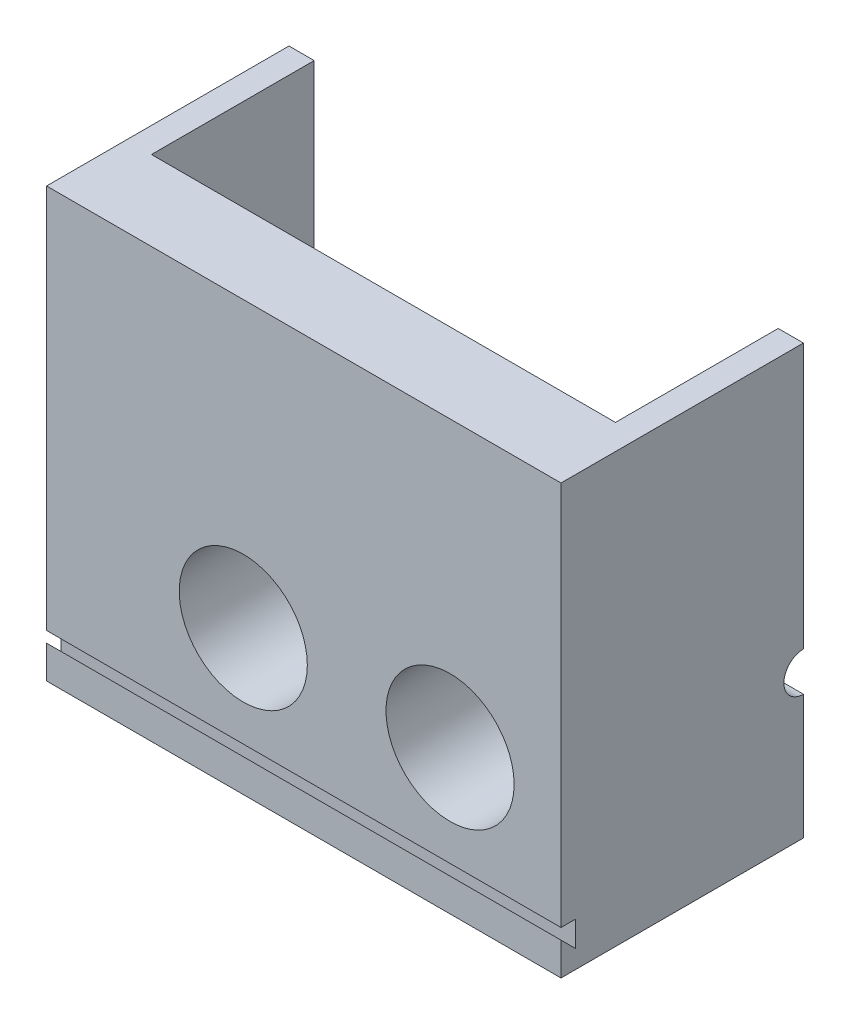
ISO-10303-21;
HEADER;
FILE_DESCRIPTION(('STEP AP214'),'2;1');
FILE_NAME('part.step','',(''),(''),'','','');
FILE_SCHEMA(('AUTOMOTIVE_DESIGN { 1 0 10303 214 1 1 1 1 }'));
ENDSEC;
DATA;
#1=APPLICATION_CONTEXT('core data for automotive mechanical design processes');
#2=APPLICATION_PROTOCOL_DEFINITION('international standard','automotive_design',2000,#1);
#3=PRODUCT_CONTEXT('',#1,'mechanical');
#4=PRODUCT('Part','Part','',(#3));
#5=PRODUCT_RELATED_PRODUCT_CATEGORY('part','',(#4));
#6=PRODUCT_DEFINITION_FORMATION('','',#4);
#7=PRODUCT_DEFINITION_CONTEXT('part definition',#1,'design');
#8=PRODUCT_DEFINITION('design','',#6,#7);
#9=PRODUCT_DEFINITION_SHAPE('','',#8);
#10=(LENGTH_UNIT() NAMED_UNIT(*) SI_UNIT(.MILLI.,.METRE.));
#11=(NAMED_UNIT(*) PLANE_ANGLE_UNIT() SI_UNIT($,.RADIAN.));
#12=(NAMED_UNIT(*) SI_UNIT($,.STERADIAN.) SOLID_ANGLE_UNIT());
#13=UNCERTAINTY_MEASURE_WITH_UNIT(LENGTH_MEASURE(1.E-05),#10,'distance_accuracy_value','');
#14=(GEOMETRIC_REPRESENTATION_CONTEXT(3) GLOBAL_UNCERTAINTY_ASSIGNED_CONTEXT((#13)) GLOBAL_UNIT_ASSIGNED_CONTEXT((#10,
#11,#12)) REPRESENTATION_CONTEXT('',''));
#15=CARTESIAN_POINT('',(0.,0.,0.));
#16=DIRECTION('',(0.,0.,1.));
#17=DIRECTION('',(1.,0.,0.));
#18=AXIS2_PLACEMENT_3D('',#15,#16,#17);
#19=CARTESIAN_POINT('',(51.,85.,48.065));
#20=DIRECTION('',(0.,0.,-1.));
#21=DIRECTION('',(-1.,0.,0.));
#22=AXIS2_PLACEMENT_3D('',#19,#20,#21);
#23=PLANE('',#22);
#24=CARTESIAN_POINT('',(29.,28.575,48.065));
#25=DIRECTION('',(0.,0.,1.));
#26=DIRECTION('',(1.,0.,0.));
#27=AXIS2_PLACEMENT_3D('',#24,#25,#26);
#28=CIRCLE('',#27,12.7);
#29=CARTESIAN_POINT('',(41.7,28.575,48.065));
#30=VERTEX_POINT('',#29);
#31=EDGE_CURVE('E416',#30,#30,#28,.T.);
#32=ORIENTED_EDGE('',*,*,#31,.F.);
#33=EDGE_LOOP('',(#32));
#34=FACE_BOUND('',#33,.T.);
#35=CARTESIAN_POINT('',(-12.,28.575,48.065));
#36=DIRECTION('',(0.,0.,1.));
#37=DIRECTION('',(1.,0.,0.));
#38=AXIS2_PLACEMENT_3D('',#35,#36,#37);
#39=CIRCLE('',#38,12.7);
#40=CARTESIAN_POINT('',(0.700000000000003,28.575,48.065));
#41=VERTEX_POINT('',#40);
#42=EDGE_CURVE('E417',#41,#41,#39,.T.);
#43=ORIENTED_EDGE('',*,*,#42,.F.);
#44=EDGE_LOOP('',(#43));
#45=FACE_BOUND('',#44,.T.);
#46=DIRECTION('',(0.,-1.,0.));
#47=VECTOR('',#46,1.);
#48=CARTESIAN_POINT('',(-51.,85.,48.065));
#49=LINE('',#48,#47);
#50=CARTESIAN_POINT('',(-51.,85.,48.065));
#51=VERTEX_POINT('',#50);
#52=CARTESIAN_POINT('',(-51.,8.67157287525382,48.065));
#53=VERTEX_POINT('',#52);
#54=EDGE_CURVE('E176',#51,#53,#49,.T.);
#55=ORIENTED_EDGE('',*,*,#54,.T.);
#56=DIRECTION('',(1.,0.,0.));
#57=VECTOR('',#56,1.);
#58=CARTESIAN_POINT('',(-51.,8.67157287525382,48.065));
#59=LINE('',#58,#57);
#60=CARTESIAN_POINT('',(51.,8.67157287525382,48.065));
#61=VERTEX_POINT('',#60);
#62=EDGE_CURVE('E345',#53,#61,#59,.T.);
#63=ORIENTED_EDGE('',*,*,#62,.T.);
#64=DIRECTION('',(0.,-1.,0.));
#65=VECTOR('',#64,1.);
#66=CARTESIAN_POINT('',(51.,85.,48.065));
#67=LINE('',#66,#65);
#68=CARTESIAN_POINT('',(51.,85.,48.065));
#69=VERTEX_POINT('',#68);
#70=EDGE_CURVE('E177',#69,#61,#67,.T.);
#71=ORIENTED_EDGE('',*,*,#70,.F.);
#72=DIRECTION('',(1.,0.,0.));
#73=VECTOR('',#72,1.);
#74=CARTESIAN_POINT('',(51.,85.,48.065));
#75=LINE('',#74,#73);
#76=EDGE_CURVE('E445',#51,#69,#75,.T.);
#77=ORIENTED_EDGE('',*,*,#76,.F.);
#78=EDGE_LOOP('',(#55,#63,#71,#77));
#79=FACE_BOUND('',#78,.T.);
#80=ADVANCED_FACE('F41',(#34,#45,#79),#23,.F.);
#81=CARTESIAN_POINT('',(-46.,85.,32.265));
#82=DIRECTION('',(0.,0.,-1.));
#83=DIRECTION('',(-1.,0.,0.));
#84=AXIS2_PLACEMENT_3D('',#81,#82,#83);
#85=PLANE('',#84);
#86=CARTESIAN_POINT('',(29.,28.575,32.265));
#87=DIRECTION('',(0.,0.,-1.));
#88=DIRECTION('',(-1.,0.,0.));
#89=AXIS2_PLACEMENT_3D('',#86,#87,#88);
#90=CIRCLE('',#89,15.5);
#91=CARTESIAN_POINT('',(13.5,28.575,32.265));
#92=VERTEX_POINT('',#91);
#93=EDGE_CURVE('E353',#92,#92,#90,.T.);
#94=ORIENTED_EDGE('',*,*,#93,.F.);
#95=EDGE_LOOP('',(#94));
#96=FACE_BOUND('',#95,.T.);
#97=DIRECTION('',(1.,0.,0.));
#98=VECTOR('',#97,1.);
#99=CARTESIAN_POINT('',(-46.,0.,32.265));
#100=LINE('',#99,#98);
#101=CARTESIAN_POINT('',(-46.,0.,32.265));
#102=VERTEX_POINT('',#101);
#103=CARTESIAN_POINT('',(46.,0.,32.265));
#104=VERTEX_POINT('',#103);
#105=EDGE_CURVE('E427',#102,#104,#100,.T.);
#106=ORIENTED_EDGE('',*,*,#105,.F.);
#107=DIRECTION('',(0.,-1.,0.));
#108=VECTOR('',#107,1.);
#109=CARTESIAN_POINT('',(-46.,85.,32.265));
#110=LINE('',#109,#108);
#111=CARTESIAN_POINT('',(-46.,85.,32.265));
#112=VERTEX_POINT('',#111);
#113=EDGE_CURVE('E440',#112,#102,#110,.T.);
#114=ORIENTED_EDGE('',*,*,#113,.F.);
#115=DIRECTION('',(1.,0.,0.));
#116=VECTOR('',#115,1.);
#117=CARTESIAN_POINT('',(-46.,85.,32.265));
#118=LINE('',#117,#116);
#119=CARTESIAN_POINT('',(46.,85.,32.265));
#120=VERTEX_POINT('',#119);
#121=EDGE_CURVE('E429',#112,#120,#118,.T.);
#122=ORIENTED_EDGE('',*,*,#121,.T.);
#123=DIRECTION('',(0.,-1.,0.));
#124=VECTOR('',#123,1.);
#125=CARTESIAN_POINT('',(46.,85.,32.265));
#126=LINE('',#125,#124);
#127=EDGE_CURVE('E431',#120,#104,#126,.T.);
#128=ORIENTED_EDGE('',*,*,#127,.T.);
#129=EDGE_LOOP('',(#106,#114,#122,#128));
#130=FACE_BOUND('',#129,.T.);
#131=CARTESIAN_POINT('',(-12.,28.575,32.265));
#132=DIRECTION('',(0.,0.,-1.));
#133=DIRECTION('',(-1.,0.,0.));
#134=AXIS2_PLACEMENT_3D('',#131,#132,#133);
#135=CIRCLE('',#134,15.5);
#136=CARTESIAN_POINT('',(-27.5,28.575,32.265));
#137=VERTEX_POINT('',#136);
#138=EDGE_CURVE('E350',#137,#137,#135,.T.);
#139=ORIENTED_EDGE('',*,*,#138,.F.);
#140=EDGE_LOOP('',(#139));
#141=FACE_BOUND('',#140,.T.);
#142=ADVANCED_FACE('F221',(#96,#130,#141),#85,.T.);
#143=CARTESIAN_POINT('',(0.,85.,0.));
#144=DIRECTION('',(0.,1.,0.));
#145=DIRECTION('',(0.,0.,1.));
#146=AXIS2_PLACEMENT_3D('',#143,#144,#145);
#147=PLANE('',#146);
#148=DIRECTION('',(-1.,0.,0.));
#149=VECTOR('',#148,1.);
#150=CARTESIAN_POINT('',(51.,85.,0.));
#151=LINE('',#150,#149);
#152=CARTESIAN_POINT('',(-46.,85.,0.));
#153=VERTEX_POINT('',#152);
#154=CARTESIAN_POINT('',(-51.,85.,0.));
#155=VERTEX_POINT('',#154);
#156=EDGE_CURVE('E396',#153,#155,#151,.T.);
#157=ORIENTED_EDGE('',*,*,#156,.T.);
#158=DIRECTION('',(0.,0.,1.));
#159=VECTOR('',#158,1.);
#160=CARTESIAN_POINT('',(-51.,85.,48.065));
#161=LINE('',#160,#159);
#162=EDGE_CURVE('E443',#155,#51,#161,.T.);
#163=ORIENTED_EDGE('',*,*,#162,.T.);
#164=ORIENTED_EDGE('',*,*,#76,.T.);
#165=DIRECTION('',(0.,0.,-1.));
#166=VECTOR('',#165,1.);
#167=CARTESIAN_POINT('',(51.,85.,48.065));
#168=LINE('',#167,#166);
#169=CARTESIAN_POINT('',(51.,85.,0.));
#170=VERTEX_POINT('',#169);
#171=EDGE_CURVE('E448',#69,#170,#168,.T.);
#172=ORIENTED_EDGE('',*,*,#171,.T.);
#173=CARTESIAN_POINT('',(46.,85.,0.));
#174=VERTEX_POINT('',#173);
#175=EDGE_CURVE('E392',#170,#174,#151,.T.);
#176=ORIENTED_EDGE('',*,*,#175,.T.);
#177=DIRECTION('',(0.,0.,-1.));
#178=VECTOR('',#177,1.);
#179=CARTESIAN_POINT('',(46.,85.,32.265));
#180=LINE('',#179,#178);
#181=EDGE_CURVE('E423',#120,#174,#180,.T.);
#182=ORIENTED_EDGE('',*,*,#181,.F.);
#183=ORIENTED_EDGE('',*,*,#121,.F.);
#184=DIRECTION('',(0.,0.,1.));
#185=VECTOR('',#184,1.);
#186=CARTESIAN_POINT('',(-46.,85.,32.265));
#187=LINE('',#186,#185);
#188=EDGE_CURVE('E426',#153,#112,#187,.T.);
#189=ORIENTED_EDGE('',*,*,#188,.F.);
#190=EDGE_LOOP('',(#157,#163,#164,#172,#176,#182,#183,#189));
#191=FACE_BOUND('',#190,.T.);
#192=ADVANCED_FACE('F228',(#191),#147,.T.);
#193=CARTESIAN_POINT('',(0.,0.,0.));
#194=DIRECTION('',(0.,1.,0.));
#195=DIRECTION('',(0.,0.,1.));
#196=AXIS2_PLACEMENT_3D('',#193,#194,#195);
#197=PLANE('',#196);
#198=DIRECTION('',(0.,0.,1.));
#199=VECTOR('',#198,1.);
#200=CARTESIAN_POINT('',(-51.,0.,48.065));
#201=LINE('',#200,#199);
#202=CARTESIAN_POINT('',(-51.,0.,0.));
#203=VERTEX_POINT('',#202);
#204=CARTESIAN_POINT('',(-51.,0.,48.065));
#205=VERTEX_POINT('',#204);
#206=EDGE_CURVE('E174',#203,#205,#201,.T.);
#207=ORIENTED_EDGE('',*,*,#206,.F.);
#208=DIRECTION('',(-1.,0.,0.));
#209=VECTOR('',#208,1.);
#210=CARTESIAN_POINT('',(51.,0.,0.));
#211=LINE('',#210,#209);
#212=CARTESIAN_POINT('',(-46.,0.,0.));
#213=VERTEX_POINT('',#212);
#214=EDGE_CURVE('E389',#213,#203,#211,.T.);
#215=ORIENTED_EDGE('',*,*,#214,.F.);
#216=DIRECTION('',(0.,0.,1.));
#217=VECTOR('',#216,1.);
#218=CARTESIAN_POINT('',(-46.,0.,32.265));
#219=LINE('',#218,#217);
#220=EDGE_CURVE('E434',#213,#102,#219,.T.);
#221=ORIENTED_EDGE('',*,*,#220,.T.);
#222=ORIENTED_EDGE('',*,*,#105,.T.);
#223=DIRECTION('',(0.,0.,-1.));
#224=VECTOR('',#223,1.);
#225=CARTESIAN_POINT('',(46.,0.,32.265));
#226=LINE('',#225,#224);
#227=CARTESIAN_POINT('',(46.,0.,0.));
#228=VERTEX_POINT('',#227);
#229=EDGE_CURVE('E420',#104,#228,#226,.T.);
#230=ORIENTED_EDGE('',*,*,#229,.T.);
#231=CARTESIAN_POINT('',(51.,0.,0.));
#232=VERTEX_POINT('',#231);
#233=EDGE_CURVE('E397',#232,#228,#211,.T.);
#234=ORIENTED_EDGE('',*,*,#233,.F.);
#235=DIRECTION('',(0.,0.,-1.));
#236=VECTOR('',#235,1.);
#237=CARTESIAN_POINT('',(51.,0.,48.065));
#238=LINE('',#237,#236);
#239=CARTESIAN_POINT('',(51.,0.,48.065));
#240=VERTEX_POINT('',#239);
#241=EDGE_CURVE('E446',#240,#232,#238,.T.);
#242=ORIENTED_EDGE('',*,*,#241,.F.);
#243=DIRECTION('',(1.,0.,0.));
#244=VECTOR('',#243,1.);
#245=CARTESIAN_POINT('',(51.,0.,48.065));
#246=LINE('',#245,#244);
#247=EDGE_CURVE('E452',#205,#240,#246,.T.);
#248=ORIENTED_EDGE('',*,*,#247,.F.);
#249=EDGE_LOOP('',(#207,#215,#221,#222,#230,#234,#242,#248));
#250=FACE_BOUND('',#249,.T.);
#251=ADVANCED_FACE('F242',(#250),#197,.F.);
#252=CARTESIAN_POINT('',(-51.,85.,48.065));
#253=DIRECTION('',(1.,0.,0.));
#254=DIRECTION('',(0.,0.,-1.));
#255=AXIS2_PLACEMENT_3D('',#252,#253,#254);
#256=PLANE('',#255);
#257=DIRECTION('',(0.,1.,0.));
#258=VECTOR('',#257,1.);
#259=CARTESIAN_POINT('',(-51.,3.67157287525381,45.2365728752538));
#260=LINE('',#259,#258);
#261=CARTESIAN_POINT('',(-51.,3.67157287525381,45.2365728752538));
#262=VERTEX_POINT('',#261);
#263=CARTESIAN_POINT('',(-51.,8.67157287525381,45.2365728752538));
#264=VERTEX_POINT('',#263);
#265=EDGE_CURVE('E160',#262,#264,#260,.T.);
#266=ORIENTED_EDGE('',*,*,#265,.T.);
#267=DIRECTION('',(0.,0.,1.));
#268=VECTOR('',#267,1.);
#269=CARTESIAN_POINT('',(-51.,8.67157287525381,45.2365728752538));
#270=LINE('',#269,#268);
#271=EDGE_CURVE('E170',#264,#53,#270,.T.);
#272=ORIENTED_EDGE('',*,*,#271,.T.);
#273=ORIENTED_EDGE('',*,*,#54,.F.);
#274=ORIENTED_EDGE('',*,*,#162,.F.);
#275=DIRECTION('',(0.,1.,0.));
#276=VECTOR('',#275,1.);
#277=CARTESIAN_POINT('',(-51.,85.,0.));
#278=LINE('',#277,#276);
#279=CARTESIAN_POINT('',(-51.,32.45,0.));
#280=VERTEX_POINT('',#279);
#281=EDGE_CURVE('E383',#280,#155,#278,.T.);
#282=ORIENTED_EDGE('',*,*,#281,.F.);
#283=CARTESIAN_POINT('',(-51.,28.575,0.));
#284=DIRECTION('',(-1.,0.,0.));
#285=DIRECTION('',(0.,0.,1.));
#286=AXIS2_PLACEMENT_3D('',#283,#284,#285);
#287=CIRCLE('',#286,3.875);
#288=CARTESIAN_POINT('',(-51.,24.7,0.));
#289=VERTEX_POINT('',#288);
#290=EDGE_CURVE('E411',#289,#280,#287,.T.);
#291=ORIENTED_EDGE('',*,*,#290,.F.);
#292=EDGE_CURVE('E64',#203,#289,#278,.T.);
#293=ORIENTED_EDGE('',*,*,#292,.F.);
#294=ORIENTED_EDGE('',*,*,#206,.T.);
#295=CARTESIAN_POINT('',(-51.,6.5,48.065));
#296=VERTEX_POINT('',#295);
#297=EDGE_CURVE('E167',#296,#205,#49,.T.);
#298=ORIENTED_EDGE('',*,*,#297,.F.);
#299=DIRECTION('',(0.,-0.707106781186547,-0.707106781186548));
#300=VECTOR('',#299,1.);
#301=CARTESIAN_POINT('',(-51.,6.5,48.065));
#302=LINE('',#301,#300);
#303=EDGE_CURVE('E153',#296,#262,#302,.T.);
#304=ORIENTED_EDGE('',*,*,#303,.T.);
#305=EDGE_LOOP('',(#266,#272,#273,#274,#282,#291,#293,#294,#298,#304));
#306=FACE_BOUND('',#305,.T.);
#307=ADVANCED_FACE('F172',(#306),#256,.F.);
#308=CARTESIAN_POINT('',(51.,6.50000000000001,48.065));
#309=VERTEX_POINT('',#308);
#310=EDGE_CURVE('E169',#309,#240,#67,.T.);
#311=ORIENTED_EDGE('',*,*,#310,.F.);
#312=DIRECTION('',(1.,0.,0.));
#313=VECTOR('',#312,1.);
#314=CARTESIAN_POINT('',(-51.,6.5,48.065));
#315=LINE('',#314,#313);
#316=EDGE_CURVE('E56',#296,#309,#315,.T.);
#317=ORIENTED_EDGE('',*,*,#316,.F.);
#318=ORIENTED_EDGE('',*,*,#297,.T.);
#319=ORIENTED_EDGE('',*,*,#247,.T.);
#320=EDGE_LOOP('',(#311,#317,#318,#319));
#321=FACE_BOUND('',#320,.T.);
#322=ADVANCED_FACE('F165',(#321),#23,.F.);
#323=CARTESIAN_POINT('',(51.,85.,48.065));
#324=DIRECTION('',(-1.,0.,0.));
#325=DIRECTION('',(0.,0.,1.));
#326=AXIS2_PLACEMENT_3D('',#323,#324,#325);
#327=PLANE('',#326);
#328=ORIENTED_EDGE('',*,*,#70,.T.);
#329=DIRECTION('',(0.,0.,1.));
#330=VECTOR('',#329,1.);
#331=CARTESIAN_POINT('',(51.,8.67157287525381,45.2365728752538));
#332=LINE('',#331,#330);
#333=CARTESIAN_POINT('',(51.,8.67157287525381,45.2365728752538));
#334=VERTEX_POINT('',#333);
#335=EDGE_CURVE('E161',#334,#61,#332,.T.);
#336=ORIENTED_EDGE('',*,*,#335,.F.);
#337=DIRECTION('',(0.,1.,0.));
#338=VECTOR('',#337,1.);
#339=CARTESIAN_POINT('',(51.,3.67157287525381,45.2365728752538));
#340=LINE('',#339,#338);
#341=CARTESIAN_POINT('',(51.,3.67157287525381,45.2365728752538));
#342=VERTEX_POINT('',#341);
#343=EDGE_CURVE('E333',#342,#334,#340,.T.);
#344=ORIENTED_EDGE('',*,*,#343,.F.);
#345=DIRECTION('',(0.,-0.707106781186547,-0.707106781186548));
#346=VECTOR('',#345,1.);
#347=CARTESIAN_POINT('',(51.,6.5,48.065));
#348=LINE('',#347,#346);
#349=EDGE_CURVE('E337',#309,#342,#348,.T.);
#350=ORIENTED_EDGE('',*,*,#349,.F.);
#351=ORIENTED_EDGE('',*,*,#310,.T.);
#352=ORIENTED_EDGE('',*,*,#241,.T.);
#353=DIRECTION('',(0.,1.,0.));
#354=VECTOR('',#353,1.);
#355=CARTESIAN_POINT('',(51.,85.,0.));
#356=LINE('',#355,#354);
#357=CARTESIAN_POINT('',(51.,24.7,0.));
#358=VERTEX_POINT('',#357);
#359=EDGE_CURVE('E386',#232,#358,#356,.T.);
#360=ORIENTED_EDGE('',*,*,#359,.T.);
#361=CARTESIAN_POINT('',(51.,28.575,0.));
#362=DIRECTION('',(-1.,0.,0.));
#363=DIRECTION('',(0.,0.,1.));
#364=AXIS2_PLACEMENT_3D('',#361,#362,#363);
#365=CIRCLE('',#364,3.875);
#366=CARTESIAN_POINT('',(51.,32.45,0.));
#367=VERTEX_POINT('',#366);
#368=EDGE_CURVE('E189',#358,#367,#365,.T.);
#369=ORIENTED_EDGE('',*,*,#368,.T.);
#370=EDGE_CURVE('E390',#367,#170,#356,.T.);
#371=ORIENTED_EDGE('',*,*,#370,.T.);
#372=ORIENTED_EDGE('',*,*,#171,.F.);
#373=EDGE_LOOP('',(#328,#336,#344,#350,#351,#352,#360,#369,#371,#372));
#374=FACE_BOUND('',#373,.T.);
#375=ADVANCED_FACE('F236',(#374),#327,.F.);
#376=CARTESIAN_POINT('',(46.,85.,32.265));
#377=DIRECTION('',(-1.,0.,0.));
#378=DIRECTION('',(0.,0.,1.));
#379=AXIS2_PLACEMENT_3D('',#376,#377,#378);
#380=PLANE('',#379);
#381=DIRECTION('',(0.,1.,0.));
#382=VECTOR('',#381,1.);
#383=CARTESIAN_POINT('',(46.,85.,0.));
#384=LINE('',#383,#382);
#385=CARTESIAN_POINT('',(46.,24.7,0.));
#386=VERTEX_POINT('',#385);
#387=EDGE_CURVE('E395',#228,#386,#384,.T.);
#388=ORIENTED_EDGE('',*,*,#387,.F.);
#389=ORIENTED_EDGE('',*,*,#229,.F.);
#390=ORIENTED_EDGE('',*,*,#127,.F.);
#391=ORIENTED_EDGE('',*,*,#181,.T.);
#392=CARTESIAN_POINT('',(46.,32.45,0.));
#393=VERTEX_POINT('',#392);
#394=EDGE_CURVE('E400',#393,#174,#384,.T.);
#395=ORIENTED_EDGE('',*,*,#394,.F.);
#396=CARTESIAN_POINT('',(46.,28.575,0.));
#397=DIRECTION('',(-1.,0.,0.));
#398=DIRECTION('',(0.,0.,1.));
#399=AXIS2_PLACEMENT_3D('',#396,#397,#398);
#400=CIRCLE('',#399,3.875);
#401=EDGE_CURVE('E188',#386,#393,#400,.T.);
#402=ORIENTED_EDGE('',*,*,#401,.F.);
#403=EDGE_LOOP('',(#388,#389,#390,#391,#395,#402));
#404=FACE_BOUND('',#403,.T.);
#405=ADVANCED_FACE('F240',(#404),#380,.T.);
#406=CARTESIAN_POINT('',(-46.,85.,32.265));
#407=DIRECTION('',(1.,0.,0.));
#408=DIRECTION('',(0.,0.,-1.));
#409=AXIS2_PLACEMENT_3D('',#406,#407,#408);
#410=PLANE('',#409);
#411=DIRECTION('',(0.,-1.,0.));
#412=VECTOR('',#411,1.);
#413=CARTESIAN_POINT('',(-46.,85.,0.));
#414=LINE('',#413,#412);
#415=CARTESIAN_POINT('',(-46.,32.45,0.));
#416=VERTEX_POINT('',#415);
#417=EDGE_CURVE('E406',#153,#416,#414,.T.);
#418=ORIENTED_EDGE('',*,*,#417,.F.);
#419=ORIENTED_EDGE('',*,*,#188,.T.);
#420=ORIENTED_EDGE('',*,*,#113,.T.);
#421=ORIENTED_EDGE('',*,*,#220,.F.);
#422=CARTESIAN_POINT('',(-46.,24.7,0.));
#423=VERTEX_POINT('',#422);
#424=EDGE_CURVE('E403',#423,#213,#414,.T.);
#425=ORIENTED_EDGE('',*,*,#424,.F.);
#426=CARTESIAN_POINT('',(-46.,28.575,0.));
#427=DIRECTION('',(1.,0.,0.));
#428=DIRECTION('',(0.,0.,-1.));
#429=AXIS2_PLACEMENT_3D('',#426,#427,#428);
#430=CIRCLE('',#429,3.875);
#431=EDGE_CURVE('E185',#416,#423,#430,.T.);
#432=ORIENTED_EDGE('',*,*,#431,.F.);
#433=EDGE_LOOP('',(#418,#419,#420,#421,#425,#432));
#434=FACE_BOUND('',#433,.T.);
#435=ADVANCED_FACE('F256',(#434),#410,.T.);
#436=CARTESIAN_POINT('',(29.,28.575,28.065));
#437=DIRECTION('',(0.,0.,1.));
#438=DIRECTION('',(1.,0.,0.));
#439=AXIS2_PLACEMENT_3D('',#436,#437,#438);
#440=CYLINDRICAL_SURFACE('',#439,12.7);
#441=CARTESIAN_POINT('',(29.,28.575,23.765));
#442=DIRECTION('',(0.,0.,-1.));
#443=DIRECTION('',(-1.,0.,0.));
#444=AXIS2_PLACEMENT_3D('',#441,#442,#443);
#445=CIRCLE('',#444,12.7);
#446=CARTESIAN_POINT('',(16.3,28.575,23.765));
#447=VERTEX_POINT('',#446);
#448=EDGE_CURVE('E49',#447,#447,#445,.T.);
#449=ORIENTED_EDGE('',*,*,#448,.T.);
#450=EDGE_LOOP('',(#449));
#451=FACE_BOUND('',#450,.T.);
#452=ORIENTED_EDGE('',*,*,#31,.T.);
#453=EDGE_LOOP('',(#452));
#454=FACE_BOUND('',#453,.T.);
#455=ADVANCED_FACE('F203',(#451,#454),#440,.F.);
#456=CARTESIAN_POINT('',(-12.,28.575,28.065));
#457=DIRECTION('',(0.,0.,1.));
#458=DIRECTION('',(1.,0.,0.));
#459=AXIS2_PLACEMENT_3D('',#456,#457,#458);
#460=CYLINDRICAL_SURFACE('',#459,12.7);
#461=CARTESIAN_POINT('',(-12.,28.575,23.765));
#462=DIRECTION('',(0.,0.,-1.));
#463=DIRECTION('',(-1.,0.,0.));
#464=AXIS2_PLACEMENT_3D('',#461,#462,#463);
#465=CIRCLE('',#464,12.7);
#466=CARTESIAN_POINT('',(-24.7,28.575,23.765));
#467=VERTEX_POINT('',#466);
#468=EDGE_CURVE('E195',#467,#467,#465,.T.);
#469=ORIENTED_EDGE('',*,*,#468,.T.);
#470=EDGE_LOOP('',(#469));
#471=FACE_BOUND('',#470,.T.);
#472=ORIENTED_EDGE('',*,*,#42,.T.);
#473=EDGE_LOOP('',(#472));
#474=FACE_BOUND('',#473,.T.);
#475=ADVANCED_FACE('F263',(#471,#474),#460,.F.);
#476=CARTESIAN_POINT('',(51.,28.575,0.));
#477=DIRECTION('',(-1.,0.,0.));
#478=DIRECTION('',(0.,0.,1.));
#479=AXIS2_PLACEMENT_3D('',#476,#477,#478);
#480=CYLINDRICAL_SURFACE('',#479,3.875);
#481=ORIENTED_EDGE('',*,*,#290,.T.);
#482=DIRECTION('',(-1.,0.,0.));
#483=VECTOR('',#482,1.);
#484=CARTESIAN_POINT('',(51.,32.45,0.));
#485=LINE('',#484,#483);
#486=EDGE_CURVE('E405',#280,#416,#485,.F.);
#487=ORIENTED_EDGE('',*,*,#486,.T.);
#488=ORIENTED_EDGE('',*,*,#431,.T.);
#489=DIRECTION('',(-1.,0.,0.));
#490=VECTOR('',#489,1.);
#491=CARTESIAN_POINT('',(51.,24.7,0.));
#492=LINE('',#491,#490);
#493=EDGE_CURVE('E401',#423,#289,#492,.T.);
#494=ORIENTED_EDGE('',*,*,#493,.T.);
#495=EDGE_LOOP('',(#481,#487,#488,#494));
#496=FACE_BOUND('',#495,.T.);
#497=ADVANCED_FACE('F266',(#496),#480,.F.);
#498=ORIENTED_EDGE('',*,*,#401,.T.);
#499=DIRECTION('',(-1.,0.,0.));
#500=VECTOR('',#499,1.);
#501=CARTESIAN_POINT('',(51.,32.45,0.));
#502=LINE('',#501,#500);
#503=EDGE_CURVE('E192',#393,#367,#502,.F.);
#504=ORIENTED_EDGE('',*,*,#503,.T.);
#505=ORIENTED_EDGE('',*,*,#368,.F.);
#506=DIRECTION('',(-1.,0.,0.));
#507=VECTOR('',#506,1.);
#508=CARTESIAN_POINT('',(51.,24.7,0.));
#509=LINE('',#508,#507);
#510=EDGE_CURVE('E180',#358,#386,#509,.T.);
#511=ORIENTED_EDGE('',*,*,#510,.T.);
#512=EDGE_LOOP('',(#498,#504,#505,#511));
#513=FACE_BOUND('',#512,.T.);
#514=ADVANCED_FACE('F270',(#513),#480,.F.);
#515=CARTESIAN_POINT('',(51.,85.,0.));
#516=DIRECTION('',(0.,0.,1.));
#517=DIRECTION('',(1.,0.,0.));
#518=AXIS2_PLACEMENT_3D('',#515,#516,#517);
#519=PLANE('',#518);
#520=CARTESIAN_POINT('',(48.5,4.675,0.));
#521=DIRECTION('',(0.,0.,-1.));
#522=DIRECTION('',(0.,-1.,0.));
#523=AXIS2_PLACEMENT_3D('',#520,#521,#522);
#524=CIRCLE('',#523,1.6);
#525=CARTESIAN_POINT('',(48.5,3.075,0.));
#526=VERTEX_POINT('',#525);
#527=EDGE_CURVE('E362',#526,#526,#524,.T.);
#528=ORIENTED_EDGE('',*,*,#527,.F.);
#529=EDGE_LOOP('',(#528));
#530=FACE_BOUND('',#529,.T.);
#531=ORIENTED_EDGE('',*,*,#387,.T.);
#532=ORIENTED_EDGE('',*,*,#510,.F.);
#533=ORIENTED_EDGE('',*,*,#359,.F.);
#534=ORIENTED_EDGE('',*,*,#233,.T.);
#535=EDGE_LOOP('',(#531,#532,#533,#534));
#536=FACE_BOUND('',#535,.T.);
#537=ADVANCED_FACE('F272',(#530,#536),#519,.F.);
#538=CARTESIAN_POINT('',(48.5,58.725,0.));
#539=DIRECTION('',(0.,0.,-1.));
#540=DIRECTION('',(0.,1.,0.));
#541=AXIS2_PLACEMENT_3D('',#538,#539,#540);
#542=CIRCLE('',#541,1.6);
#543=CARTESIAN_POINT('',(48.5,60.325,0.));
#544=VERTEX_POINT('',#543);
#545=EDGE_CURVE('E365',#544,#544,#542,.T.);
#546=ORIENTED_EDGE('',*,*,#545,.F.);
#547=EDGE_LOOP('',(#546));
#548=FACE_BOUND('',#547,.T.);
#549=ORIENTED_EDGE('',*,*,#394,.T.);
#550=ORIENTED_EDGE('',*,*,#175,.F.);
#551=ORIENTED_EDGE('',*,*,#370,.F.);
#552=ORIENTED_EDGE('',*,*,#503,.F.);
#553=EDGE_LOOP('',(#549,#550,#551,#552));
#554=FACE_BOUND('',#553,.T.);
#555=ADVANCED_FACE('F275',(#548,#554),#519,.F.);
#556=CARTESIAN_POINT('',(-48.5,4.675,0.));
#557=DIRECTION('',(0.,0.,-1.));
#558=DIRECTION('',(0.,1.,0.));
#559=AXIS2_PLACEMENT_3D('',#556,#557,#558);
#560=CIRCLE('',#559,1.6);
#561=CARTESIAN_POINT('',(-48.5,6.275,0.));
#562=VERTEX_POINT('',#561);
#563=EDGE_CURVE('E369',#562,#562,#560,.T.);
#564=ORIENTED_EDGE('',*,*,#563,.F.);
#565=EDGE_LOOP('',(#564));
#566=FACE_BOUND('',#565,.T.);
#567=ORIENTED_EDGE('',*,*,#424,.T.);
#568=ORIENTED_EDGE('',*,*,#214,.T.);
#569=ORIENTED_EDGE('',*,*,#292,.T.);
#570=ORIENTED_EDGE('',*,*,#493,.F.);
#571=EDGE_LOOP('',(#567,#568,#569,#570));
#572=FACE_BOUND('',#571,.T.);
#573=ADVANCED_FACE('F479',(#566,#572),#519,.F.);
#574=CARTESIAN_POINT('',(-48.5,58.725,0.));
#575=DIRECTION('',(0.,0.,-1.));
#576=DIRECTION('',(0.,-1.,0.));
#577=AXIS2_PLACEMENT_3D('',#574,#575,#576);
#578=CIRCLE('',#577,1.6);
#579=CARTESIAN_POINT('',(-48.5,57.125,0.));
#580=VERTEX_POINT('',#579);
#581=EDGE_CURVE('E375',#580,#580,#578,.T.);
#582=ORIENTED_EDGE('',*,*,#581,.F.);
#583=EDGE_LOOP('',(#582));
#584=FACE_BOUND('',#583,.T.);
#585=ORIENTED_EDGE('',*,*,#417,.T.);
#586=ORIENTED_EDGE('',*,*,#486,.F.);
#587=ORIENTED_EDGE('',*,*,#281,.T.);
#588=ORIENTED_EDGE('',*,*,#156,.F.);
#589=EDGE_LOOP('',(#585,#586,#587,#588));
#590=FACE_BOUND('',#589,.T.);
#591=ADVANCED_FACE('F277',(#584,#590),#519,.F.);
#592=CARTESIAN_POINT('',(-48.5,58.725,10.));
#593=DIRECTION('',(0.,0.,-1.));
#594=DIRECTION('',(0.,1.,0.));
#595=AXIS2_PLACEMENT_3D('',#592,#593,#594);
#596=CYLINDRICAL_SURFACE('',#595,1.6);
#597=CARTESIAN_POINT('',(-48.5,58.725,10.));
#598=DIRECTION('',(0.,0.,-1.));
#599=DIRECTION('',(0.,-1.,0.));
#600=AXIS2_PLACEMENT_3D('',#597,#598,#599);
#601=CIRCLE('',#600,1.6);
#602=CARTESIAN_POINT('',(-48.5,57.125,10.));
#603=VERTEX_POINT('',#602);
#604=EDGE_CURVE('E359',#603,#603,#601,.T.);
#605=ORIENTED_EDGE('',*,*,#604,.F.);
#606=EDGE_LOOP('',(#605));
#607=FACE_BOUND('',#606,.T.);
#608=ORIENTED_EDGE('',*,*,#581,.T.);
#609=EDGE_LOOP('',(#608));
#610=FACE_BOUND('',#609,.T.);
#611=ADVANCED_FACE('F292',(#607,#610),#596,.F.);
#612=CARTESIAN_POINT('',(-48.5,58.725,10.));
#613=DIRECTION('',(0.,0.,1.));
#614=DIRECTION('',(0.,-1.,0.));
#615=AXIS2_PLACEMENT_3D('',#612,#613,#614);
#616=PLANE('',#615);
#617=ORIENTED_EDGE('',*,*,#604,.T.);
#618=EDGE_LOOP('',(#617));
#619=FACE_BOUND('',#618,.T.);
#620=ADVANCED_FACE('F288',(#619),#616,.F.);
#621=CARTESIAN_POINT('',(-48.5,4.675,10.));
#622=DIRECTION('',(0.,0.,-1.));
#623=DIRECTION('',(0.,1.,0.));
#624=AXIS2_PLACEMENT_3D('',#621,#622,#623);
#625=CYLINDRICAL_SURFACE('',#624,1.6);
#626=CARTESIAN_POINT('',(-48.5,4.675,10.));
#627=DIRECTION('',(0.,0.,-1.));
#628=DIRECTION('',(0.,1.,0.));
#629=AXIS2_PLACEMENT_3D('',#626,#627,#628);
#630=CIRCLE('',#629,1.6);
#631=CARTESIAN_POINT('',(-48.5,6.27499999999999,10.));
#632=VERTEX_POINT('',#631);
#633=EDGE_CURVE('E372',#632,#632,#630,.T.);
#634=ORIENTED_EDGE('',*,*,#633,.F.);
#635=EDGE_LOOP('',(#634));
#636=FACE_BOUND('',#635,.T.);
#637=ORIENTED_EDGE('',*,*,#563,.T.);
#638=EDGE_LOOP('',(#637));
#639=FACE_BOUND('',#638,.T.);
#640=ADVANCED_FACE('F291',(#636,#639),#625,.F.);
#641=CARTESIAN_POINT('',(-48.5,4.675,10.));
#642=DIRECTION('',(0.,0.,-1.));
#643=DIRECTION('',(0.,1.,0.));
#644=AXIS2_PLACEMENT_3D('',#641,#642,#643);
#645=PLANE('',#644);
#646=ORIENTED_EDGE('',*,*,#633,.T.);
#647=EDGE_LOOP('',(#646));
#648=FACE_BOUND('',#647,.T.);
#649=ADVANCED_FACE('F282',(#648),#645,.T.);
#650=CARTESIAN_POINT('',(48.5,58.725,10.));
#651=DIRECTION('',(0.,0.,-1.));
#652=DIRECTION('',(0.,1.,0.));
#653=AXIS2_PLACEMENT_3D('',#650,#651,#652);
#654=CYLINDRICAL_SURFACE('',#653,1.6);
#655=CARTESIAN_POINT('',(48.5,58.725,10.));
#656=DIRECTION('',(0.,0.,-1.));
#657=DIRECTION('',(0.,1.,0.));
#658=AXIS2_PLACEMENT_3D('',#655,#656,#657);
#659=CIRCLE('',#658,1.6);
#660=CARTESIAN_POINT('',(48.5,60.325,10.));
#661=VERTEX_POINT('',#660);
#662=EDGE_CURVE('E380',#661,#661,#659,.T.);
#663=ORIENTED_EDGE('',*,*,#662,.F.);
#664=EDGE_LOOP('',(#663));
#665=FACE_BOUND('',#664,.T.);
#666=ORIENTED_EDGE('',*,*,#545,.T.);
#667=EDGE_LOOP('',(#666));
#668=FACE_BOUND('',#667,.T.);
#669=ADVANCED_FACE('F278',(#665,#668),#654,.F.);
#670=CARTESIAN_POINT('',(48.5,58.725,10.));
#671=DIRECTION('',(0.,0.,-1.));
#672=DIRECTION('',(0.,1.,0.));
#673=AXIS2_PLACEMENT_3D('',#670,#671,#672);
#674=PLANE('',#673);
#675=ORIENTED_EDGE('',*,*,#662,.T.);
#676=EDGE_LOOP('',(#675));
#677=FACE_BOUND('',#676,.T.);
#678=ADVANCED_FACE('F281',(#677),#674,.T.);
#679=CARTESIAN_POINT('',(48.5,4.675,10.));
#680=DIRECTION('',(0.,0.,-1.));
#681=DIRECTION('',(0.,1.,0.));
#682=AXIS2_PLACEMENT_3D('',#679,#680,#681);
#683=CYLINDRICAL_SURFACE('',#682,1.6);
#684=CARTESIAN_POINT('',(48.5,4.675,10.));
#685=DIRECTION('',(0.,0.,-1.));
#686=DIRECTION('',(0.,-1.,0.));
#687=AXIS2_PLACEMENT_3D('',#684,#685,#686);
#688=CIRCLE('',#687,1.6);
#689=CARTESIAN_POINT('',(48.5,3.075,10.));
#690=VERTEX_POINT('',#689);
#691=EDGE_CURVE('E366',#690,#690,#688,.T.);
#692=ORIENTED_EDGE('',*,*,#691,.F.);
#693=EDGE_LOOP('',(#692));
#694=FACE_BOUND('',#693,.T.);
#695=ORIENTED_EDGE('',*,*,#527,.T.);
#696=EDGE_LOOP('',(#695));
#697=FACE_BOUND('',#696,.T.);
#698=ADVANCED_FACE('F286',(#694,#697),#683,.F.);
#699=CARTESIAN_POINT('',(48.5,4.675,10.));
#700=DIRECTION('',(0.,0.,1.));
#701=DIRECTION('',(0.,-1.,0.));
#702=AXIS2_PLACEMENT_3D('',#699,#700,#701);
#703=PLANE('',#702);
#704=ORIENTED_EDGE('',*,*,#691,.T.);
#705=EDGE_LOOP('',(#704));
#706=FACE_BOUND('',#705,.T.);
#707=ADVANCED_FACE('F303',(#706),#703,.F.);
#708=CARTESIAN_POINT('',(29.,28.575,22.265));
#709=DIRECTION('',(0.,0.,-1.));
#710=DIRECTION('',(-1.,0.,0.));
#711=AXIS2_PLACEMENT_3D('',#708,#709,#710);
#712=PLANE('',#711);
#713=CARTESIAN_POINT('',(29.,28.575,22.265));
#714=DIRECTION('',(0.,0.,-1.));
#715=DIRECTION('',(-1.,0.,0.));
#716=AXIS2_PLACEMENT_3D('',#713,#714,#715);
#717=CIRCLE('',#716,14.2);
#718=CARTESIAN_POINT('',(14.8,28.575,22.265));
#719=VERTEX_POINT('',#718);
#720=EDGE_CURVE('E11',#719,#719,#717,.F.);
#721=ORIENTED_EDGE('',*,*,#720,.T.);
#722=EDGE_LOOP('',(#721));
#723=FACE_BOUND('',#722,.T.);
#724=CARTESIAN_POINT('',(29.,28.575,22.265));
#725=DIRECTION('',(0.,0.,-1.));
#726=DIRECTION('',(-1.,0.,0.));
#727=AXIS2_PLACEMENT_3D('',#724,#725,#726);
#728=CIRCLE('',#727,15.5);
#729=CARTESIAN_POINT('',(13.5,28.575,22.265));
#730=VERTEX_POINT('',#729);
#731=EDGE_CURVE('E356',#730,#730,#728,.T.);
#732=ORIENTED_EDGE('',*,*,#731,.T.);
#733=EDGE_LOOP('',(#732));
#734=FACE_BOUND('',#733,.T.);
#735=ADVANCED_FACE('F306',(#723,#734),#712,.T.);
#736=CARTESIAN_POINT('',(29.,28.575,22.265));
#737=DIRECTION('',(0.,0.,1.));
#738=DIRECTION('',(1.,0.,0.));
#739=AXIS2_PLACEMENT_3D('',#736,#737,#738);
#740=CYLINDRICAL_SURFACE('',#739,15.5);
#741=ORIENTED_EDGE('',*,*,#731,.F.);
#742=EDGE_LOOP('',(#741));
#743=FACE_BOUND('',#742,.T.);
#744=ORIENTED_EDGE('',*,*,#93,.T.);
#745=EDGE_LOOP('',(#744));
#746=FACE_BOUND('',#745,.T.);
#747=ADVANCED_FACE('F311',(#743,#746),#740,.T.);
#748=CARTESIAN_POINT('',(-12.,28.575,22.265));
#749=DIRECTION('',(0.,0.,-1.));
#750=DIRECTION('',(-1.,0.,0.));
#751=AXIS2_PLACEMENT_3D('',#748,#749,#750);
#752=PLANE('',#751);
#753=CARTESIAN_POINT('',(-12.,28.575,22.265));
#754=DIRECTION('',(0.,0.,-1.));
#755=DIRECTION('',(-1.,0.,0.));
#756=AXIS2_PLACEMENT_3D('',#753,#754,#755);
#757=CIRCLE('',#756,14.2);
#758=CARTESIAN_POINT('',(-26.2,28.575,22.265));
#759=VERTEX_POINT('',#758);
#760=EDGE_CURVE('E198',#759,#759,#757,.F.);
#761=ORIENTED_EDGE('',*,*,#760,.T.);
#762=EDGE_LOOP('',(#761));
#763=FACE_BOUND('',#762,.T.);
#764=CARTESIAN_POINT('',(-12.,28.575,22.265));
#765=DIRECTION('',(0.,0.,-1.));
#766=DIRECTION('',(-1.,0.,0.));
#767=AXIS2_PLACEMENT_3D('',#764,#765,#766);
#768=CIRCLE('',#767,15.5);
#769=CARTESIAN_POINT('',(-27.5,28.575,22.265));
#770=VERTEX_POINT('',#769);
#771=EDGE_CURVE('E347',#770,#770,#768,.T.);
#772=ORIENTED_EDGE('',*,*,#771,.T.);
#773=EDGE_LOOP('',(#772));
#774=FACE_BOUND('',#773,.T.);
#775=ADVANCED_FACE('F314',(#763,#774),#752,.T.);
#776=CARTESIAN_POINT('',(-12.,28.575,22.265));
#777=DIRECTION('',(0.,0.,1.));
#778=DIRECTION('',(1.,0.,0.));
#779=AXIS2_PLACEMENT_3D('',#776,#777,#778);
#780=CYLINDRICAL_SURFACE('',#779,15.5);
#781=ORIENTED_EDGE('',*,*,#771,.F.);
#782=EDGE_LOOP('',(#781));
#783=FACE_BOUND('',#782,.T.);
#784=ORIENTED_EDGE('',*,*,#138,.T.);
#785=EDGE_LOOP('',(#784));
#786=FACE_BOUND('',#785,.T.);
#787=ADVANCED_FACE('F218',(#783,#786),#780,.T.);
#788=CARTESIAN_POINT('',(-12.,28.575,23.765));
#789=DIRECTION('',(0.,0.,-1.));
#790=DIRECTION('',(-1.,0.,0.));
#791=AXIS2_PLACEMENT_3D('',#788,#789,#790);
#792=TOROIDAL_SURFACE('',#791,14.2,1.5);
#793=ORIENTED_EDGE('',*,*,#760,.F.);
#794=EDGE_LOOP('',(#793));
#795=FACE_BOUND('',#794,.T.);
#796=ORIENTED_EDGE('',*,*,#468,.F.);
#797=EDGE_LOOP('',(#796));
#798=FACE_BOUND('',#797,.T.);
#799=ADVANCED_FACE('F208',(#795,#798),#792,.T.);
#800=CARTESIAN_POINT('',(29.,28.575,23.765));
#801=DIRECTION('',(0.,0.,-1.));
#802=DIRECTION('',(-1.,0.,0.));
#803=AXIS2_PLACEMENT_3D('',#800,#801,#802);
#804=TOROIDAL_SURFACE('',#803,14.2,1.5);
#805=ORIENTED_EDGE('',*,*,#720,.F.);
#806=EDGE_LOOP('',(#805));
#807=FACE_BOUND('',#806,.T.);
#808=ORIENTED_EDGE('',*,*,#448,.F.);
#809=EDGE_LOOP('',(#808));
#810=FACE_BOUND('',#809,.T.);
#811=ADVANCED_FACE('F43',(#807,#810),#804,.T.);
#812=CARTESIAN_POINT('',(-51.,8.67157287525381,45.2365728752538));
#813=DIRECTION('',(0.,1.,0.));
#814=DIRECTION('',(0.,0.,1.));
#815=AXIS2_PLACEMENT_3D('',#812,#813,#814);
#816=PLANE('',#815);
#817=ORIENTED_EDGE('',*,*,#335,.T.);
#818=ORIENTED_EDGE('',*,*,#62,.F.);
#819=ORIENTED_EDGE('',*,*,#271,.F.);
#820=DIRECTION('',(1.,0.,0.));
#821=VECTOR('',#820,1.);
#822=CARTESIAN_POINT('',(-51.,8.67157287525381,45.2365728752538));
#823=LINE('',#822,#821);
#824=EDGE_CURVE('E335',#264,#334,#823,.T.);
#825=ORIENTED_EDGE('',*,*,#824,.T.);
#826=EDGE_LOOP('',(#817,#818,#819,#825));
#827=FACE_BOUND('',#826,.T.);
#828=ADVANCED_FACE('F207',(#827),#816,.F.);
#829=CARTESIAN_POINT('',(-51.,3.67157287525381,45.2365728752538));
#830=DIRECTION('',(0.,0.,-1.));
#831=DIRECTION('',(-1.,0.,0.));
#832=AXIS2_PLACEMENT_3D('',#829,#830,#831);
#833=PLANE('',#832);
#834=ORIENTED_EDGE('',*,*,#343,.T.);
#835=ORIENTED_EDGE('',*,*,#824,.F.);
#836=ORIENTED_EDGE('',*,*,#265,.F.);
#837=DIRECTION('',(1.,0.,0.));
#838=VECTOR('',#837,1.);
#839=CARTESIAN_POINT('',(-51.,3.67157287525381,45.2365728752538));
#840=LINE('',#839,#838);
#841=EDGE_CURVE('E155',#262,#342,#840,.T.);
#842=ORIENTED_EDGE('',*,*,#841,.T.);
#843=EDGE_LOOP('',(#834,#835,#836,#842));
#844=FACE_BOUND('',#843,.T.);
#845=ADVANCED_FACE('F215',(#844),#833,.F.);
#846=CARTESIAN_POINT('',(-51.,6.5,48.065));
#847=DIRECTION('',(0.,-0.707106781186548,0.707106781186547));
#848=DIRECTION('',(0.,-0.707106781186547,-0.707106781186548));
#849=AXIS2_PLACEMENT_3D('',#846,#847,#848);
#850=PLANE('',#849);
#851=ORIENTED_EDGE('',*,*,#349,.T.);
#852=ORIENTED_EDGE('',*,*,#841,.F.);
#853=ORIENTED_EDGE('',*,*,#303,.F.);
#854=ORIENTED_EDGE('',*,*,#316,.T.);
#855=EDGE_LOOP('',(#851,#852,#853,#854));
#856=FACE_BOUND('',#855,.T.);
#857=ADVANCED_FACE('F154',(#856),#850,.F.);
#858=CLOSED_SHELL('',(#80,#142,#192,#251,#307,#322,#375,#405,#435,#455,#475,#497,#514,#537,#555,
#573,#591,#611,#620,#640,#649,#669,#678,#698,#707,#735,#747,#775,#787,#799,#811,#828,#845,#857));
#859=MANIFOLD_SOLID_BREP('B2',#858);
#860=ADVANCED_BREP_SHAPE_REPRESENTATION('',(#18,#859),#14);
#861=SHAPE_DEFINITION_REPRESENTATION(#9,#860);
ENDSEC;
END-ISO-10303-21;
